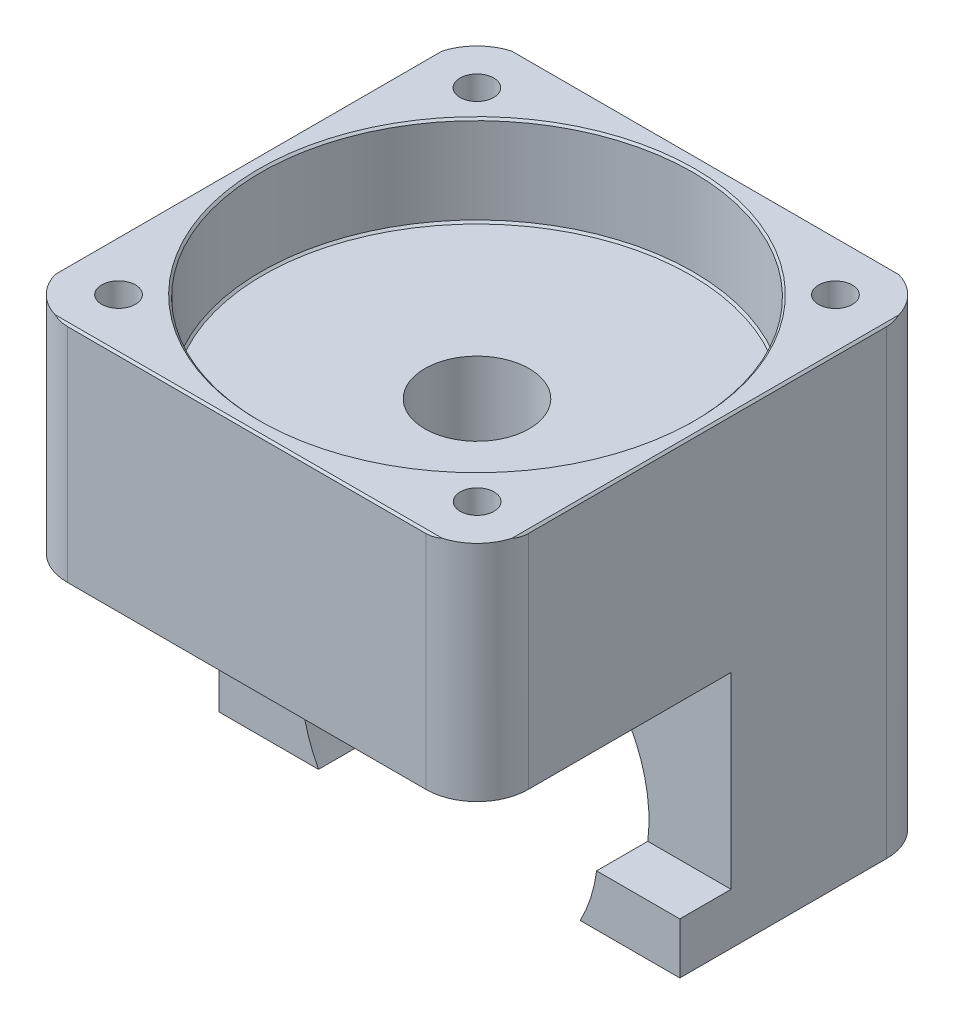
ISO-10303-21;
HEADER;
FILE_DESCRIPTION(('STEP AP214'),'2;1');
FILE_NAME('part.step','',(''),(''),'','','');
FILE_SCHEMA(('AUTOMOTIVE_DESIGN { 1 0 10303 214 1 1 1 1 }'));
ENDSEC;
DATA;
#1=APPLICATION_CONTEXT('core data for automotive mechanical design processes');
#2=APPLICATION_PROTOCOL_DEFINITION('international standard','automotive_design',2000,#1);
#3=PRODUCT_CONTEXT('',#1,'mechanical');
#4=PRODUCT('Part','Part','',(#3));
#5=PRODUCT_RELATED_PRODUCT_CATEGORY('part','',(#4));
#6=PRODUCT_DEFINITION_FORMATION('','',#4);
#7=PRODUCT_DEFINITION_CONTEXT('part definition',#1,'design');
#8=PRODUCT_DEFINITION('design','',#6,#7);
#9=PRODUCT_DEFINITION_SHAPE('','',#8);
#10=(LENGTH_UNIT() NAMED_UNIT(*) SI_UNIT(.MILLI.,.METRE.));
#11=(NAMED_UNIT(*) PLANE_ANGLE_UNIT() SI_UNIT($,.RADIAN.));
#12=(NAMED_UNIT(*) SI_UNIT($,.STERADIAN.) SOLID_ANGLE_UNIT());
#13=UNCERTAINTY_MEASURE_WITH_UNIT(LENGTH_MEASURE(1.E-05),#10,'distance_accuracy_value','');
#14=(GEOMETRIC_REPRESENTATION_CONTEXT(3) GLOBAL_UNCERTAINTY_ASSIGNED_CONTEXT((#13)) GLOBAL_UNIT_ASSIGNED_CONTEXT((#10,
#11,#12)) REPRESENTATION_CONTEXT('',''));
#15=CARTESIAN_POINT('',(0.,0.,0.));
#16=DIRECTION('',(0.,0.,1.));
#17=DIRECTION('',(1.,0.,0.));
#18=AXIS2_PLACEMENT_3D('',#15,#16,#17);
#19=CARTESIAN_POINT('',(-17.5126870222207,60.,17.5));
#20=DIRECTION('',(0.,-1.,0.));
#21=DIRECTION('',(0.,0.,-1.));
#22=AXIS2_PLACEMENT_3D('',#19,#20,#21);
#23=CYLINDRICAL_SURFACE('',#22,5.);
#24=DIRECTION('',(0.,-1.,0.));
#25=VECTOR('',#24,1.);
#26=CARTESIAN_POINT('',(-17.5126870222207,60.,22.5));
#27=LINE('',#26,#25);
#28=CARTESIAN_POINT('',(-17.5126870222207,59.8,22.5));
#29=VERTEX_POINT('',#28);
#30=CARTESIAN_POINT('',(-17.5126870222207,38.1506542929803,22.5));
#31=VERTEX_POINT('',#30);
#32=EDGE_CURVE('E342',#29,#31,#27,.T.);
#33=ORIENTED_EDGE('',*,*,#32,.F.);
#34=CARTESIAN_POINT('',(-17.5126870222207,64.8,17.5));
#35=DIRECTION('',(0.,-0.707106781186548,-0.707106781186548));
#36=DIRECTION('',(0.,-0.707106781186548,0.707106781186548));
#37=AXIS2_PLACEMENT_3D('',#34,#35,#36);
#38=ELLIPSE('',#37,7.07106781186547,5.);
#39=CARTESIAN_POINT('',(-18.9126870222207,60.,22.3));
#40=VERTEX_POINT('',#39);
#41=EDGE_CURVE('E48',#40,#29,#38,.F.);
#42=ORIENTED_EDGE('',*,*,#41,.F.);
#43=CARTESIAN_POINT('',(-17.5126870222207,60.,17.5));
#44=DIRECTION('',(0.,-1.,0.));
#45=DIRECTION('',(0.,0.,-1.));
#46=AXIS2_PLACEMENT_3D('',#43,#44,#45);
#47=CIRCLE('',#46,5.);
#48=CARTESIAN_POINT('',(-22.3126870222207,60.,18.9));
#49=VERTEX_POINT('',#48);
#50=EDGE_CURVE('E353',#49,#40,#47,.F.);
#51=ORIENTED_EDGE('',*,*,#50,.F.);
#52=CARTESIAN_POINT('',(-17.5126870222207,64.8,17.5));
#53=DIRECTION('',(0.707106781186548,-0.707106781186548,0.));
#54=DIRECTION('',(-0.707106781186548,-0.707106781186548,0.));
#55=AXIS2_PLACEMENT_3D('',#52,#53,#54);
#56=ELLIPSE('',#55,7.07106781186547,5.);
#57=CARTESIAN_POINT('',(-22.5126870222207,59.8,17.5));
#58=VERTEX_POINT('',#57);
#59=EDGE_CURVE('E354',#58,#49,#56,.F.);
#60=ORIENTED_EDGE('',*,*,#59,.F.);
#61=DIRECTION('',(0.,-1.,0.));
#62=VECTOR('',#61,1.);
#63=CARTESIAN_POINT('',(-22.5126870222207,60.,17.5));
#64=LINE('',#63,#62);
#65=CARTESIAN_POINT('',(-22.5126870222207,38.1506542929803,17.5));
#66=VERTEX_POINT('',#65);
#67=EDGE_CURVE('E350',#66,#58,#64,.F.);
#68=ORIENTED_EDGE('',*,*,#67,.F.);
#69=CARTESIAN_POINT('',(-17.5126870222207,38.1506542929803,17.5));
#70=DIRECTION('',(0.,1.,0.));
#71=DIRECTION('',(0.,0.,1.));
#72=AXIS2_PLACEMENT_3D('',#69,#70,#71);
#73=CIRCLE('',#72,5.);
#74=EDGE_CURVE('E11',#31,#66,#73,.F.);
#75=ORIENTED_EDGE('',*,*,#74,.F.);
#76=EDGE_LOOP('',(#33,#42,#51,#60,#68,#75));
#77=FACE_BOUND('',#76,.T.);
#78=ADVANCED_FACE('F41',(#77),#23,.T.);
#79=CARTESIAN_POINT('',(17.5126870222207,60.,17.5));
#80=DIRECTION('',(0.,-1.,0.));
#81=DIRECTION('',(0.,0.,-1.));
#82=AXIS2_PLACEMENT_3D('',#79,#80,#81);
#83=CYLINDRICAL_SURFACE('',#82,5.);
#84=DIRECTION('',(0.,-1.,0.));
#85=VECTOR('',#84,1.);
#86=CARTESIAN_POINT('',(22.5126870222207,60.,17.5));
#87=LINE('',#86,#85);
#88=CARTESIAN_POINT('',(22.5126870222207,59.8,17.5));
#89=VERTEX_POINT('',#88);
#90=CARTESIAN_POINT('',(22.5126870222207,38.1506542929803,17.5));
#91=VERTEX_POINT('',#90);
#92=EDGE_CURVE('E328',#89,#91,#87,.T.);
#93=ORIENTED_EDGE('',*,*,#92,.F.);
#94=CARTESIAN_POINT('',(17.5126870222207,64.8,17.5));
#95=DIRECTION('',(-0.707106781186548,-0.707106781186548,0.));
#96=DIRECTION('',(0.707106781186548,-0.707106781186548,0.));
#97=AXIS2_PLACEMENT_3D('',#94,#95,#96);
#98=ELLIPSE('',#97,7.07106781186547,5.);
#99=CARTESIAN_POINT('',(22.3126870222208,60.,18.9));
#100=VERTEX_POINT('',#99);
#101=EDGE_CURVE('E344',#100,#89,#98,.F.);
#102=ORIENTED_EDGE('',*,*,#101,.F.);
#103=CARTESIAN_POINT('',(17.5126870222207,60.,17.5));
#104=DIRECTION('',(0.,-1.,0.));
#105=DIRECTION('',(0.,0.,-1.));
#106=AXIS2_PLACEMENT_3D('',#103,#104,#105);
#107=CIRCLE('',#106,5.);
#108=CARTESIAN_POINT('',(18.9126870222207,60.,22.3));
#109=VERTEX_POINT('',#108);
#110=EDGE_CURVE('E336',#109,#100,#107,.F.);
#111=ORIENTED_EDGE('',*,*,#110,.F.);
#112=CARTESIAN_POINT('',(17.5126870222207,64.8,17.5));
#113=DIRECTION('',(0.,-0.707106781186548,-0.707106781186548));
#114=DIRECTION('',(0.,-0.707106781186548,0.707106781186548));
#115=AXIS2_PLACEMENT_3D('',#112,#113,#114);
#116=ELLIPSE('',#115,7.07106781186547,5.);
#117=CARTESIAN_POINT('',(17.5126870222207,59.8,22.5));
#118=VERTEX_POINT('',#117);
#119=EDGE_CURVE('E332',#118,#109,#116,.F.);
#120=ORIENTED_EDGE('',*,*,#119,.F.);
#121=DIRECTION('',(0.,-1.,0.));
#122=VECTOR('',#121,1.);
#123=CARTESIAN_POINT('',(17.5126870222207,60.,22.5));
#124=LINE('',#123,#122);
#125=CARTESIAN_POINT('',(17.5126870222207,38.1506542929803,22.5));
#126=VERTEX_POINT('',#125);
#127=EDGE_CURVE('E331',#126,#118,#124,.F.);
#128=ORIENTED_EDGE('',*,*,#127,.F.);
#129=CARTESIAN_POINT('',(17.5126870222207,38.1506542929803,17.5));
#130=DIRECTION('',(0.,1.,0.));
#131=DIRECTION('',(0.,0.,1.));
#132=AXIS2_PLACEMENT_3D('',#129,#130,#131);
#133=CIRCLE('',#132,5.);
#134=EDGE_CURVE('E345',#91,#126,#133,.F.);
#135=ORIENTED_EDGE('',*,*,#134,.F.);
#136=EDGE_LOOP('',(#93,#102,#111,#120,#128,#135));
#137=FACE_BOUND('',#136,.T.);
#138=ADVANCED_FACE('F367',(#137),#83,.T.);
#139=CARTESIAN_POINT('',(-17.5126870222207,60.,-17.5));
#140=DIRECTION('',(0.,1.,0.));
#141=DIRECTION('',(0.,0.,1.));
#142=AXIS2_PLACEMENT_3D('',#139,#140,#141);
#143=CYLINDRICAL_SURFACE('',#142,5.);
#144=DIRECTION('',(0.,1.,0.));
#145=VECTOR('',#144,1.);
#146=CARTESIAN_POINT('',(-17.5126870222207,60.,-22.5));
#147=LINE('',#146,#145);
#148=CARTESIAN_POINT('',(-17.5126870222207,14.8,-22.5));
#149=VERTEX_POINT('',#148);
#150=CARTESIAN_POINT('',(-17.5126870222207,59.8,-22.5));
#151=VERTEX_POINT('',#150);
#152=EDGE_CURVE('E315',#149,#151,#147,.T.);
#153=ORIENTED_EDGE('',*,*,#152,.F.);
#154=CARTESIAN_POINT('',(-17.5126870222207,14.8,-17.5));
#155=DIRECTION('',(0.,1.,0.));
#156=DIRECTION('',(0.,0.,1.));
#157=AXIS2_PLACEMENT_3D('',#154,#155,#156);
#158=CIRCLE('',#157,5.);
#159=CARTESIAN_POINT('',(-22.5126870222207,14.8,-17.5));
#160=VERTEX_POINT('',#159);
#161=EDGE_CURVE('E326',#160,#149,#158,.F.);
#162=ORIENTED_EDGE('',*,*,#161,.F.);
#163=DIRECTION('',(0.,1.,0.));
#164=VECTOR('',#163,1.);
#165=CARTESIAN_POINT('',(-22.5126870222207,60.,-17.5));
#166=LINE('',#165,#164);
#167=CARTESIAN_POINT('',(-22.5126870222207,59.8,-17.5));
#168=VERTEX_POINT('',#167);
#169=EDGE_CURVE('E323',#168,#160,#166,.F.);
#170=ORIENTED_EDGE('',*,*,#169,.F.);
#171=CARTESIAN_POINT('',(-17.5126870222207,64.8,-17.5));
#172=DIRECTION('',(0.707106781186548,-0.707106781186548,0.));
#173=DIRECTION('',(0.707106781186548,0.707106781186548,0.));
#174=AXIS2_PLACEMENT_3D('',#171,#172,#173);
#175=ELLIPSE('',#174,7.07106781186547,5.);
#176=CARTESIAN_POINT('',(-22.3126870222207,60.,-18.9));
#177=VERTEX_POINT('',#176);
#178=EDGE_CURVE('E324',#177,#168,#175,.F.);
#179=ORIENTED_EDGE('',*,*,#178,.F.);
#180=CARTESIAN_POINT('',(-17.5126870222207,60.,-17.5));
#181=DIRECTION('',(0.,-1.,0.));
#182=DIRECTION('',(0.,0.,-1.));
#183=AXIS2_PLACEMENT_3D('',#180,#181,#182);
#184=CIRCLE('',#183,5.);
#185=CARTESIAN_POINT('',(-18.9126870222207,60.,-22.3));
#186=VERTEX_POINT('',#185);
#187=EDGE_CURVE('E319',#186,#177,#184,.F.);
#188=ORIENTED_EDGE('',*,*,#187,.F.);
#189=CARTESIAN_POINT('',(-17.5126870222207,64.8,-17.5));
#190=DIRECTION('',(0.,-0.707106781186548,0.707106781186548));
#191=DIRECTION('',(0.,0.707106781186548,0.707106781186548));
#192=AXIS2_PLACEMENT_3D('',#189,#190,#191);
#193=ELLIPSE('',#192,7.07106781186547,5.);
#194=EDGE_CURVE('E314',#151,#186,#193,.F.);
#195=ORIENTED_EDGE('',*,*,#194,.F.);
#196=EDGE_LOOP('',(#153,#162,#170,#179,#188,#195));
#197=FACE_BOUND('',#196,.T.);
#198=ADVANCED_FACE('F421',(#197),#143,.T.);
#199=CARTESIAN_POINT('',(17.5126870222207,60.,-17.5));
#200=DIRECTION('',(0.,-1.,0.));
#201=DIRECTION('',(0.,0.,-1.));
#202=AXIS2_PLACEMENT_3D('',#199,#200,#201);
#203=CYLINDRICAL_SURFACE('',#202,5.);
#204=DIRECTION('',(0.,-1.,0.));
#205=VECTOR('',#204,1.);
#206=CARTESIAN_POINT('',(17.5126870222207,60.,-22.5));
#207=LINE('',#206,#205);
#208=CARTESIAN_POINT('',(17.5126870222207,59.8,-22.5));
#209=VERTEX_POINT('',#208);
#210=CARTESIAN_POINT('',(17.5126870222207,14.8,-22.5));
#211=VERTEX_POINT('',#210);
#212=EDGE_CURVE('E294',#209,#211,#207,.T.);
#213=ORIENTED_EDGE('',*,*,#212,.F.);
#214=CARTESIAN_POINT('',(17.5126870222207,64.8,-17.5));
#215=DIRECTION('',(0.,-0.707106781186548,0.707106781186548));
#216=DIRECTION('',(0.,-0.707106781186548,-0.707106781186548));
#217=AXIS2_PLACEMENT_3D('',#214,#215,#216);
#218=ELLIPSE('',#217,7.07106781186547,5.);
#219=CARTESIAN_POINT('',(18.9126870222207,60.,-22.3));
#220=VERTEX_POINT('',#219);
#221=EDGE_CURVE('E310',#220,#209,#218,.F.);
#222=ORIENTED_EDGE('',*,*,#221,.F.);
#223=CARTESIAN_POINT('',(17.5126870222207,60.,-17.5));
#224=DIRECTION('',(0.,-1.,0.));
#225=DIRECTION('',(0.,0.,-1.));
#226=AXIS2_PLACEMENT_3D('',#223,#224,#225);
#227=CIRCLE('',#226,5.);
#228=CARTESIAN_POINT('',(22.3126870222207,60.,-18.9));
#229=VERTEX_POINT('',#228);
#230=EDGE_CURVE('E302',#229,#220,#227,.F.);
#231=ORIENTED_EDGE('',*,*,#230,.F.);
#232=CARTESIAN_POINT('',(17.5126870222207,64.8,-17.5));
#233=DIRECTION('',(-0.707106781186548,-0.707106781186548,0.));
#234=DIRECTION('',(0.707106781186548,-0.707106781186548,0.));
#235=AXIS2_PLACEMENT_3D('',#232,#233,#234);
#236=ELLIPSE('',#235,7.07106781186547,5.);
#237=CARTESIAN_POINT('',(22.5126870222207,59.8,-17.5));
#238=VERTEX_POINT('',#237);
#239=EDGE_CURVE('E301',#238,#229,#236,.F.);
#240=ORIENTED_EDGE('',*,*,#239,.F.);
#241=DIRECTION('',(0.,-1.,0.));
#242=VECTOR('',#241,1.);
#243=CARTESIAN_POINT('',(22.5126870222207,60.,-17.5));
#244=LINE('',#243,#242);
#245=CARTESIAN_POINT('',(22.5126870222207,14.8,-17.5));
#246=VERTEX_POINT('',#245);
#247=EDGE_CURVE('E296',#246,#238,#244,.F.);
#248=ORIENTED_EDGE('',*,*,#247,.F.);
#249=CARTESIAN_POINT('',(17.5126870222207,14.8,-17.5));
#250=DIRECTION('',(0.,1.,0.));
#251=DIRECTION('',(0.,0.,1.));
#252=AXIS2_PLACEMENT_3D('',#249,#250,#251);
#253=CIRCLE('',#252,5.);
#254=EDGE_CURVE('E309',#211,#246,#253,.F.);
#255=ORIENTED_EDGE('',*,*,#254,.F.);
#256=EDGE_LOOP('',(#213,#222,#231,#240,#248,#255));
#257=FACE_BOUND('',#256,.T.);
#258=ADVANCED_FACE('F385',(#257),#203,.T.);
#259=CARTESIAN_POINT('',(22.5126870222207,60.,22.5));
#260=DIRECTION('',(-1.,0.,0.));
#261=DIRECTION('',(0.,0.,1.));
#262=AXIS2_PLACEMENT_3D('',#259,#260,#261);
#263=PLANE('',#262);
#264=DIRECTION('',(0.,0.,1.));
#265=VECTOR('',#264,1.);
#266=CARTESIAN_POINT('',(22.5126870222207,59.8,22.5));
#267=LINE('',#266,#265);
#268=EDGE_CURVE('E276',#238,#89,#267,.T.);
#269=ORIENTED_EDGE('',*,*,#268,.T.);
#270=ORIENTED_EDGE('',*,*,#92,.T.);
#271=DIRECTION('',(0.,0.,1.));
#272=VECTOR('',#271,1.);
#273=CARTESIAN_POINT('',(22.5126870222207,38.1506542929803,-2.3));
#274=LINE('',#273,#272);
#275=CARTESIAN_POINT('',(22.5126870222207,38.1506542929803,-2.3));
#276=VERTEX_POINT('',#275);
#277=EDGE_CURVE('E235',#276,#91,#274,.T.);
#278=ORIENTED_EDGE('',*,*,#277,.F.);
#279=DIRECTION('',(0.,1.,0.));
#280=VECTOR('',#279,1.);
#281=CARTESIAN_POINT('',(22.5126870222207,38.1506542929803,-2.3));
#282=LINE('',#281,#280);
#283=CARTESIAN_POINT('',(22.5126870222207,19.8,-2.3));
#284=VERTEX_POINT('',#283);
#285=EDGE_CURVE('E184',#284,#276,#282,.T.);
#286=ORIENTED_EDGE('',*,*,#285,.F.);
#287=DIRECTION('',(0.,0.,-1.));
#288=VECTOR('',#287,1.);
#289=CARTESIAN_POINT('',(22.5126870222207,19.8,2.7));
#290=LINE('',#289,#288);
#291=CARTESIAN_POINT('',(22.5126870222207,19.8,2.7));
#292=VERTEX_POINT('',#291);
#293=EDGE_CURVE('E54',#292,#284,#290,.T.);
#294=ORIENTED_EDGE('',*,*,#293,.F.);
#295=DIRECTION('',(0.,-1.,0.));
#296=VECTOR('',#295,1.);
#297=CARTESIAN_POINT('',(22.5126870222207,14.8,2.7));
#298=LINE('',#297,#296);
#299=CARTESIAN_POINT('',(22.5126870222207,14.8,2.7));
#300=VERTEX_POINT('',#299);
#301=EDGE_CURVE('E185',#292,#300,#298,.T.);
#302=ORIENTED_EDGE('',*,*,#301,.T.);
#303=DIRECTION('',(0.,0.,1.));
#304=VECTOR('',#303,1.);
#305=CARTESIAN_POINT('',(22.5126870222207,14.8,-22.5));
#306=LINE('',#305,#304);
#307=EDGE_CURVE('E238',#246,#300,#306,.T.);
#308=ORIENTED_EDGE('',*,*,#307,.F.);
#309=ORIENTED_EDGE('',*,*,#247,.T.);
#310=EDGE_LOOP('',(#269,#270,#278,#286,#294,#302,#308,#309));
#311=FACE_BOUND('',#310,.T.);
#312=ADVANCED_FACE('F179',(#311),#263,.F.);
#313=CARTESIAN_POINT('',(0.,14.8,0.));
#314=DIRECTION('',(0.,1.,0.));
#315=DIRECTION('',(0.,0.,1.));
#316=AXIS2_PLACEMENT_3D('',#313,#314,#315);
#317=PLANE('',#316);
#318=DIRECTION('',(1.,0.,0.));
#319=VECTOR('',#318,1.);
#320=CARTESIAN_POINT('',(-22.5126870222207,14.8,-22.5));
#321=LINE('',#320,#319);
#322=CARTESIAN_POINT('',(12.7796140692147,14.8,-22.5));
#323=VERTEX_POINT('',#322);
#324=EDGE_CURVE('E244',#323,#211,#321,.T.);
#325=ORIENTED_EDGE('',*,*,#324,.T.);
#326=ORIENTED_EDGE('',*,*,#254,.T.);
#327=ORIENTED_EDGE('',*,*,#307,.T.);
#328=DIRECTION('',(-1.,0.,0.));
#329=VECTOR('',#328,1.);
#330=CARTESIAN_POINT('',(22.5126870222207,14.8,2.7));
#331=LINE('',#330,#329);
#332=CARTESIAN_POINT('',(12.7796140692147,14.8,2.7));
#333=VERTEX_POINT('',#332);
#334=EDGE_CURVE('E192',#300,#333,#331,.T.);
#335=ORIENTED_EDGE('',*,*,#334,.T.);
#336=DIRECTION('',(0.,0.,1.));
#337=VECTOR('',#336,1.);
#338=CARTESIAN_POINT('',(12.7796140692147,14.8,-22.5));
#339=LINE('',#338,#337);
#340=EDGE_CURVE('E290',#323,#333,#339,.T.);
#341=ORIENTED_EDGE('',*,*,#340,.F.);
#342=EDGE_LOOP('',(#325,#326,#327,#335,#341));
#343=FACE_BOUND('',#342,.T.);
#344=ADVANCED_FACE('F383',(#343),#317,.F.);
#345=DIRECTION('',(0.,0.,-1.));
#346=VECTOR('',#345,1.);
#347=CARTESIAN_POINT('',(-22.5126870222207,14.8,-22.5));
#348=LINE('',#347,#346);
#349=CARTESIAN_POINT('',(-22.5126870222207,14.8,2.7));
#350=VERTEX_POINT('',#349);
#351=EDGE_CURVE('E245',#350,#160,#348,.T.);
#352=ORIENTED_EDGE('',*,*,#351,.T.);
#353=ORIENTED_EDGE('',*,*,#161,.T.);
#354=CARTESIAN_POINT('',(-12.7796140692147,14.8,-22.5));
#355=VERTEX_POINT('',#354);
#356=EDGE_CURVE('E246',#149,#355,#321,.T.);
#357=ORIENTED_EDGE('',*,*,#356,.T.);
#358=DIRECTION('',(0.,0.,1.));
#359=VECTOR('',#358,1.);
#360=CARTESIAN_POINT('',(-12.7796140692147,14.8,-22.5));
#361=LINE('',#360,#359);
#362=CARTESIAN_POINT('',(-12.7796140692147,14.8,2.7));
#363=VERTEX_POINT('',#362);
#364=EDGE_CURVE('E287',#363,#355,#361,.F.);
#365=ORIENTED_EDGE('',*,*,#364,.F.);
#366=DIRECTION('',(1.,0.,0.));
#367=VECTOR('',#366,1.);
#368=CARTESIAN_POINT('',(-22.5126870222207,14.8,2.7));
#369=LINE('',#368,#367);
#370=EDGE_CURVE('E214',#350,#363,#369,.T.);
#371=ORIENTED_EDGE('',*,*,#370,.F.);
#372=EDGE_LOOP('',(#352,#353,#357,#365,#371));
#373=FACE_BOUND('',#372,.T.);
#374=ADVANCED_FACE('F422',(#373),#317,.F.);
#375=CARTESIAN_POINT('',(-22.5126870222207,60.,22.5));
#376=DIRECTION('',(0.,0.,-1.));
#377=DIRECTION('',(-1.,0.,0.));
#378=AXIS2_PLACEMENT_3D('',#375,#376,#377);
#379=PLANE('',#378);
#380=DIRECTION('',(-1.,0.,0.));
#381=VECTOR('',#380,1.);
#382=CARTESIAN_POINT('',(-22.5126870222207,59.8,22.5));
#383=LINE('',#382,#381);
#384=EDGE_CURVE('E267',#118,#29,#383,.T.);
#385=ORIENTED_EDGE('',*,*,#384,.T.);
#386=ORIENTED_EDGE('',*,*,#32,.T.);
#387=DIRECTION('',(-1.,0.,0.));
#388=VECTOR('',#387,1.);
#389=CARTESIAN_POINT('',(-22.5126870222207,38.1506542929803,22.5));
#390=LINE('',#389,#388);
#391=EDGE_CURVE('E222',#126,#31,#390,.T.);
#392=ORIENTED_EDGE('',*,*,#391,.F.);
#393=ORIENTED_EDGE('',*,*,#127,.T.);
#394=EDGE_LOOP('',(#385,#386,#392,#393));
#395=FACE_BOUND('',#394,.T.);
#396=ADVANCED_FACE('F362',(#395),#379,.F.);
#397=CARTESIAN_POINT('',(0.,21.6506542929803,-22.5));
#398=DIRECTION('',(0.,0.,1.));
#399=DIRECTION('',(1.,0.,0.));
#400=AXIS2_PLACEMENT_3D('',#397,#398,#399);
#401=CYLINDRICAL_SURFACE('',#400,14.5);
#402=CARTESIAN_POINT('',(0.,21.6506542929803,-2.3));
#403=DIRECTION('',(0.,0.,1.));
#404=DIRECTION('',(1.,0.,0.));
#405=AXIS2_PLACEMENT_3D('',#402,#403,#404);
#406=CIRCLE('',#405,14.5);
#407=CARTESIAN_POINT('',(-14.3814143493564,19.8,-2.3));
#408=VERTEX_POINT('',#407);
#409=CARTESIAN_POINT('',(14.3814143493564,19.8,-2.3));
#410=VERTEX_POINT('',#409);
#411=EDGE_CURVE('E291',#408,#410,#406,.F.);
#412=ORIENTED_EDGE('',*,*,#411,.F.);
#413=DIRECTION('',(0.,0.,-1.));
#414=VECTOR('',#413,1.);
#415=CARTESIAN_POINT('',(-14.3814143493564,19.8,2.7));
#416=LINE('',#415,#414);
#417=CARTESIAN_POINT('',(-14.3814143493564,19.8,2.7));
#418=VERTEX_POINT('',#417);
#419=EDGE_CURVE('E221',#418,#408,#416,.T.);
#420=ORIENTED_EDGE('',*,*,#419,.F.);
#421=CARTESIAN_POINT('',(0.,21.6506542929803,2.7));
#422=DIRECTION('',(0.,0.,-1.));
#423=DIRECTION('',(-1.,0.,0.));
#424=AXIS2_PLACEMENT_3D('',#421,#422,#423);
#425=CIRCLE('',#424,14.5);
#426=EDGE_CURVE('E213',#363,#418,#425,.T.);
#427=ORIENTED_EDGE('',*,*,#426,.F.);
#428=ORIENTED_EDGE('',*,*,#364,.T.);
#429=CARTESIAN_POINT('',(0.,21.6506542929803,-22.5));
#430=DIRECTION('',(0.,0.,1.));
#431=DIRECTION('',(1.,0.,0.));
#432=AXIS2_PLACEMENT_3D('',#429,#430,#431);
#433=CIRCLE('',#432,14.5);
#434=EDGE_CURVE('E247',#323,#355,#433,.T.);
#435=ORIENTED_EDGE('',*,*,#434,.F.);
#436=ORIENTED_EDGE('',*,*,#340,.T.);
#437=CARTESIAN_POINT('',(0.,21.6506542929803,2.7));
#438=DIRECTION('',(0.,0.,1.));
#439=DIRECTION('',(1.,0.,0.));
#440=AXIS2_PLACEMENT_3D('',#437,#438,#439);
#441=CIRCLE('',#440,14.5);
#442=CARTESIAN_POINT('',(14.3814143493564,19.8,2.7));
#443=VERTEX_POINT('',#442);
#444=EDGE_CURVE('E198',#333,#443,#441,.T.);
#445=ORIENTED_EDGE('',*,*,#444,.T.);
#446=DIRECTION('',(0.,0.,-1.));
#447=VECTOR('',#446,1.);
#448=CARTESIAN_POINT('',(14.3814143493564,19.8,2.7));
#449=LINE('',#448,#447);
#450=EDGE_CURVE('E187',#443,#410,#449,.T.);
#451=ORIENTED_EDGE('',*,*,#450,.T.);
#452=EDGE_LOOP('',(#412,#420,#427,#428,#435,#436,#445,#451));
#453=FACE_BOUND('',#452,.T.);
#454=ADVANCED_FACE('F414',(#453),#401,.F.);
#455=CARTESIAN_POINT('',(-22.5126870222207,60.,22.5));
#456=DIRECTION('',(1.,0.,0.));
#457=DIRECTION('',(0.,0.,-1.));
#458=AXIS2_PLACEMENT_3D('',#455,#456,#457);
#459=PLANE('',#458);
#460=DIRECTION('',(0.,0.,1.));
#461=VECTOR('',#460,1.);
#462=CARTESIAN_POINT('',(-22.5126870222207,38.1506542929803,-2.3));
#463=LINE('',#462,#461);
#464=CARTESIAN_POINT('',(-22.5126870222207,38.1506542929803,-2.3));
#465=VERTEX_POINT('',#464);
#466=EDGE_CURVE('E232',#465,#66,#463,.T.);
#467=ORIENTED_EDGE('',*,*,#466,.T.);
#468=ORIENTED_EDGE('',*,*,#67,.T.);
#469=DIRECTION('',(0.,0.,-1.));
#470=VECTOR('',#469,1.);
#471=CARTESIAN_POINT('',(-22.5126870222207,59.8,22.5));
#472=LINE('',#471,#470);
#473=EDGE_CURVE('E271',#58,#168,#472,.T.);
#474=ORIENTED_EDGE('',*,*,#473,.T.);
#475=ORIENTED_EDGE('',*,*,#169,.T.);
#476=ORIENTED_EDGE('',*,*,#351,.F.);
#477=DIRECTION('',(0.,-1.,0.));
#478=VECTOR('',#477,1.);
#479=CARTESIAN_POINT('',(-22.5126870222207,14.8,2.7));
#480=LINE('',#479,#478);
#481=CARTESIAN_POINT('',(-22.5126870222207,19.8,2.7));
#482=VERTEX_POINT('',#481);
#483=EDGE_CURVE('E206',#482,#350,#480,.T.);
#484=ORIENTED_EDGE('',*,*,#483,.F.);
#485=DIRECTION('',(0.,0.,-1.));
#486=VECTOR('',#485,1.);
#487=CARTESIAN_POINT('',(-22.5126870222207,19.8,2.7));
#488=LINE('',#487,#486);
#489=CARTESIAN_POINT('',(-22.5126870222207,19.8,-2.3));
#490=VERTEX_POINT('',#489);
#491=EDGE_CURVE('E220',#482,#490,#488,.T.);
#492=ORIENTED_EDGE('',*,*,#491,.T.);
#493=DIRECTION('',(0.,-1.,0.));
#494=VECTOR('',#493,1.);
#495=CARTESIAN_POINT('',(-22.5126870222207,38.1506542929803,-2.3));
#496=LINE('',#495,#494);
#497=EDGE_CURVE('E228',#465,#490,#496,.T.);
#498=ORIENTED_EDGE('',*,*,#497,.F.);
#499=EDGE_LOOP('',(#467,#468,#474,#475,#476,#484,#492,#498));
#500=FACE_BOUND('',#499,.T.);
#501=ADVANCED_FACE('F405',(#500),#459,.F.);
#502=CARTESIAN_POINT('',(-22.5126870222207,60.,-22.5));
#503=DIRECTION('',(0.,0.,1.));
#504=DIRECTION('',(1.,0.,0.));
#505=AXIS2_PLACEMENT_3D('',#502,#503,#504);
#506=PLANE('',#505);
#507=ORIENTED_EDGE('',*,*,#356,.F.);
#508=ORIENTED_EDGE('',*,*,#152,.T.);
#509=DIRECTION('',(1.,0.,0.));
#510=VECTOR('',#509,1.);
#511=CARTESIAN_POINT('',(-22.5126870222207,59.8,-22.5));
#512=LINE('',#511,#510);
#513=EDGE_CURVE('E273',#151,#209,#512,.T.);
#514=ORIENTED_EDGE('',*,*,#513,.T.);
#515=ORIENTED_EDGE('',*,*,#212,.T.);
#516=ORIENTED_EDGE('',*,*,#324,.F.);
#517=ORIENTED_EDGE('',*,*,#434,.T.);
#518=EDGE_LOOP('',(#507,#508,#514,#515,#516,#517));
#519=FACE_BOUND('',#518,.T.);
#520=ADVANCED_FACE('F388',(#519),#506,.F.);
#521=CARTESIAN_POINT('',(0.,60.,0.));
#522=DIRECTION('',(0.,-1.,0.));
#523=DIRECTION('',(0.,0.,-1.));
#524=AXIS2_PLACEMENT_3D('',#521,#522,#523);
#525=PLANE('',#524);
#526=CARTESIAN_POINT('',(17.5126870222207,60.,17.5));
#527=DIRECTION('',(0.,1.,0.));
#528=DIRECTION('',(0.,0.,-1.));
#529=AXIS2_PLACEMENT_3D('',#526,#527,#528);
#530=CIRCLE('',#529,1.65);
#531=CARTESIAN_POINT('',(17.5126870222207,60.,15.85));
#532=VERTEX_POINT('',#531);
#533=EDGE_CURVE('E788',#532,#532,#530,.T.);
#534=ORIENTED_EDGE('',*,*,#533,.F.);
#535=EDGE_LOOP('',(#534));
#536=FACE_BOUND('',#535,.T.);
#537=CARTESIAN_POINT('',(17.5126870222207,60.,-17.5));
#538=DIRECTION('',(0.,-1.,0.));
#539=DIRECTION('',(0.,0.,1.));
#540=AXIS2_PLACEMENT_3D('',#537,#538,#539);
#541=CIRCLE('',#540,1.65);
#542=CARTESIAN_POINT('',(17.5126870222207,60.,-15.85));
#543=VERTEX_POINT('',#542);
#544=EDGE_CURVE('E790',#543,#543,#541,.T.);
#545=ORIENTED_EDGE('',*,*,#544,.T.);
#546=EDGE_LOOP('',(#545));
#547=FACE_BOUND('',#546,.T.);
#548=CARTESIAN_POINT('',(-17.5126870222207,60.,17.5));
#549=DIRECTION('',(0.,-1.,0.));
#550=DIRECTION('',(0.,0.,-1.));
#551=AXIS2_PLACEMENT_3D('',#548,#549,#550);
#552=CIRCLE('',#551,1.65);
#553=CARTESIAN_POINT('',(-17.5126870222207,60.,15.85));
#554=VERTEX_POINT('',#553);
#555=EDGE_CURVE('E800',#554,#554,#552,.T.);
#556=ORIENTED_EDGE('',*,*,#555,.T.);
#557=EDGE_LOOP('',(#556));
#558=FACE_BOUND('',#557,.T.);
#559=CARTESIAN_POINT('',(-17.5126870222207,60.,-17.5));
#560=DIRECTION('',(0.,1.,0.));
#561=DIRECTION('',(0.,0.,1.));
#562=AXIS2_PLACEMENT_3D('',#559,#560,#561);
#563=CIRCLE('',#562,1.65);
#564=CARTESIAN_POINT('',(-17.5126870222207,60.,-15.85));
#565=VERTEX_POINT('',#564);
#566=EDGE_CURVE('E805',#565,#565,#563,.T.);
#567=ORIENTED_EDGE('',*,*,#566,.F.);
#568=EDGE_LOOP('',(#567));
#569=FACE_BOUND('',#568,.T.);
#570=DIRECTION('',(0.,0.,1.));
#571=VECTOR('',#570,1.);
#572=CARTESIAN_POINT('',(-22.3126870222207,60.,0.));
#573=LINE('',#572,#571);
#574=EDGE_CURVE('E262',#177,#49,#573,.T.);
#575=ORIENTED_EDGE('',*,*,#574,.T.);
#576=ORIENTED_EDGE('',*,*,#50,.T.);
#577=DIRECTION('',(1.,0.,0.));
#578=VECTOR('',#577,1.);
#579=CARTESIAN_POINT('',(0.,60.,22.3));
#580=LINE('',#579,#578);
#581=EDGE_CURVE('E270',#40,#109,#580,.T.);
#582=ORIENTED_EDGE('',*,*,#581,.T.);
#583=ORIENTED_EDGE('',*,*,#110,.T.);
#584=DIRECTION('',(0.,0.,-1.));
#585=VECTOR('',#584,1.);
#586=CARTESIAN_POINT('',(22.3126870222207,60.,0.));
#587=LINE('',#586,#585);
#588=EDGE_CURVE('E257',#100,#229,#587,.T.);
#589=ORIENTED_EDGE('',*,*,#588,.T.);
#590=ORIENTED_EDGE('',*,*,#230,.T.);
#591=DIRECTION('',(-1.,0.,0.));
#592=VECTOR('',#591,1.);
#593=CARTESIAN_POINT('',(0.,60.,-22.3));
#594=LINE('',#593,#592);
#595=EDGE_CURVE('E261',#220,#186,#594,.T.);
#596=ORIENTED_EDGE('',*,*,#595,.T.);
#597=ORIENTED_EDGE('',*,*,#187,.T.);
#598=EDGE_LOOP('',(#575,#576,#582,#583,#589,#590,#596,#597));
#599=FACE_BOUND('',#598,.T.);
#600=CARTESIAN_POINT('',(0.,60.,0.));
#601=DIRECTION('',(0.,-1.,0.));
#602=DIRECTION('',(0.,0.,-1.));
#603=AXIS2_PLACEMENT_3D('',#600,#601,#602);
#604=CIRCLE('',#603,21.3);
#605=CARTESIAN_POINT('',(0.,60.,-21.3));
#606=VERTEX_POINT('',#605);
#607=EDGE_CURVE('E253',#606,#606,#604,.T.);
#608=ORIENTED_EDGE('',*,*,#607,.T.);
#609=EDGE_LOOP('',(#608));
#610=FACE_BOUND('',#609,.T.);
#611=ADVANCED_FACE('F373',(#536,#547,#558,#569,#599,#610),#525,.F.);
#612=CARTESIAN_POINT('',(0.,51.2,0.));
#613=DIRECTION('',(0.,1.,0.));
#614=DIRECTION('',(0.,0.,1.));
#615=AXIS2_PLACEMENT_3D('',#612,#613,#614);
#616=CYLINDRICAL_SURFACE('',#615,21.1);
#617=CARTESIAN_POINT('',(0.,59.8,0.));
#618=DIRECTION('',(0.,-1.,0.));
#619=DIRECTION('',(0.,0.,-1.));
#620=AXIS2_PLACEMENT_3D('',#617,#618,#619);
#621=CIRCLE('',#620,21.1);
#622=CARTESIAN_POINT('',(0.,59.8,-21.1));
#623=VERTEX_POINT('',#622);
#624=EDGE_CURVE('E281',#623,#623,#621,.F.);
#625=ORIENTED_EDGE('',*,*,#624,.T.);
#626=EDGE_LOOP('',(#625));
#627=FACE_BOUND('',#626,.T.);
#628=CARTESIAN_POINT('',(0.,51.4,0.));
#629=DIRECTION('',(0.,1.,0.));
#630=DIRECTION('',(0.,0.,1.));
#631=AXIS2_PLACEMENT_3D('',#628,#629,#630);
#632=CIRCLE('',#631,21.1);
#633=CARTESIAN_POINT('',(0.,51.4,21.1));
#634=VERTEX_POINT('',#633);
#635=EDGE_CURVE('E278',#634,#634,#632,.F.);
#636=ORIENTED_EDGE('',*,*,#635,.T.);
#637=EDGE_LOOP('',(#636));
#638=FACE_BOUND('',#637,.T.);
#639=ADVANCED_FACE('F569',(#627,#638),#616,.F.);
#640=CARTESIAN_POINT('',(0.,51.2,0.));
#641=DIRECTION('',(0.,1.,0.));
#642=DIRECTION('',(0.,0.,1.));
#643=AXIS2_PLACEMENT_3D('',#640,#641,#642);
#644=PLANE('',#643);
#645=CARTESIAN_POINT('',(0.,51.2,0.));
#646=DIRECTION('',(0.,1.,0.));
#647=DIRECTION('',(0.,0.,1.));
#648=AXIS2_PLACEMENT_3D('',#645,#646,#647);
#649=CIRCLE('',#648,20.9);
#650=CARTESIAN_POINT('',(0.,51.2,20.9));
#651=VERTEX_POINT('',#650);
#652=EDGE_CURVE('E282',#651,#651,#649,.T.);
#653=ORIENTED_EDGE('',*,*,#652,.T.);
#654=EDGE_LOOP('',(#653));
#655=FACE_BOUND('',#654,.T.);
#656=CARTESIAN_POINT('',(0.,51.2,0.));
#657=DIRECTION('',(0.,1.,0.));
#658=DIRECTION('',(0.,0.,1.));
#659=AXIS2_PLACEMENT_3D('',#656,#657,#658);
#660=CIRCLE('',#659,5.1);
#661=CARTESIAN_POINT('',(0.,51.2,5.1));
#662=VERTEX_POINT('',#661);
#663=EDGE_CURVE('E252',#662,#662,#660,.T.);
#664=ORIENTED_EDGE('',*,*,#663,.F.);
#665=EDGE_LOOP('',(#664));
#666=FACE_BOUND('',#665,.T.);
#667=ADVANCED_FACE('F730',(#655,#666),#644,.T.);
#668=CARTESIAN_POINT('',(0.,39.4,0.));
#669=DIRECTION('',(0.,1.,0.));
#670=DIRECTION('',(0.,0.,1.));
#671=AXIS2_PLACEMENT_3D('',#668,#669,#670);
#672=CYLINDRICAL_SURFACE('',#671,5.1);
#673=CARTESIAN_POINT('',(0.,39.4,0.));
#674=DIRECTION('',(0.,1.,0.));
#675=DIRECTION('',(0.,0.,1.));
#676=AXIS2_PLACEMENT_3D('',#673,#674,#675);
#677=CIRCLE('',#676,5.1);
#678=CARTESIAN_POINT('',(0.,39.4,5.1));
#679=VERTEX_POINT('',#678);
#680=EDGE_CURVE('E255',#679,#679,#677,.T.);
#681=ORIENTED_EDGE('',*,*,#680,.F.);
#682=EDGE_LOOP('',(#681));
#683=FACE_BOUND('',#682,.T.);
#684=ORIENTED_EDGE('',*,*,#663,.T.);
#685=EDGE_LOOP('',(#684));
#686=FACE_BOUND('',#685,.T.);
#687=ADVANCED_FACE('F720',(#683,#686),#672,.F.);
#688=CARTESIAN_POINT('',(0.,39.4,0.));
#689=DIRECTION('',(0.,1.,0.));
#690=DIRECTION('',(0.,0.,1.));
#691=AXIS2_PLACEMENT_3D('',#688,#689,#690);
#692=PLANE('',#691);
#693=ORIENTED_EDGE('',*,*,#680,.T.);
#694=EDGE_LOOP('',(#693));
#695=FACE_BOUND('',#694,.T.);
#696=ADVANCED_FACE('F708',(#695),#692,.T.);
#697=CARTESIAN_POINT('',(0.,60.,-22.3));
#698=DIRECTION('',(0.,-0.707106781186548,0.707106781186548));
#699=DIRECTION('',(-1.,0.,0.));
#700=AXIS2_PLACEMENT_3D('',#697,#698,#699);
#701=PLANE('',#700);
#702=ORIENTED_EDGE('',*,*,#513,.F.);
#703=ORIENTED_EDGE('',*,*,#194,.T.);
#704=ORIENTED_EDGE('',*,*,#595,.F.);
#705=ORIENTED_EDGE('',*,*,#221,.T.);
#706=EDGE_LOOP('',(#702,#703,#704,#705));
#707=FACE_BOUND('',#706,.T.);
#708=ADVANCED_FACE('F392',(#707),#701,.F.);
#709=CARTESIAN_POINT('',(-22.3126870222207,60.,0.));
#710=DIRECTION('',(0.707106781186548,-0.707106781186548,0.));
#711=DIRECTION('',(0.,0.,1.));
#712=AXIS2_PLACEMENT_3D('',#709,#710,#711);
#713=PLANE('',#712);
#714=ORIENTED_EDGE('',*,*,#473,.F.);
#715=ORIENTED_EDGE('',*,*,#59,.T.);
#716=ORIENTED_EDGE('',*,*,#574,.F.);
#717=ORIENTED_EDGE('',*,*,#178,.T.);
#718=EDGE_LOOP('',(#714,#715,#716,#717));
#719=FACE_BOUND('',#718,.T.);
#720=ADVANCED_FACE('F397',(#719),#713,.F.);
#721=CARTESIAN_POINT('',(22.3126870222207,60.,0.));
#722=DIRECTION('',(-0.707106781186548,-0.707106781186548,0.));
#723=DIRECTION('',(0.,0.,-1.));
#724=AXIS2_PLACEMENT_3D('',#721,#722,#723);
#725=PLANE('',#724);
#726=ORIENTED_EDGE('',*,*,#588,.F.);
#727=ORIENTED_EDGE('',*,*,#101,.T.);
#728=ORIENTED_EDGE('',*,*,#268,.F.);
#729=ORIENTED_EDGE('',*,*,#239,.T.);
#730=EDGE_LOOP('',(#726,#727,#728,#729));
#731=FACE_BOUND('',#730,.T.);
#732=ADVANCED_FACE('F380',(#731),#725,.F.);
#733=CARTESIAN_POINT('',(0.,60.,22.3));
#734=DIRECTION('',(0.,-0.707106781186548,-0.707106781186548));
#735=DIRECTION('',(1.,0.,0.));
#736=AXIS2_PLACEMENT_3D('',#733,#734,#735);
#737=PLANE('',#736);
#738=ORIENTED_EDGE('',*,*,#581,.F.);
#739=ORIENTED_EDGE('',*,*,#41,.T.);
#740=ORIENTED_EDGE('',*,*,#384,.F.);
#741=ORIENTED_EDGE('',*,*,#119,.T.);
#742=EDGE_LOOP('',(#738,#739,#740,#741));
#743=FACE_BOUND('',#742,.T.);
#744=ADVANCED_FACE('F359',(#743),#737,.F.);
#745=CARTESIAN_POINT('',(0.,59.8,0.));
#746=DIRECTION('',(0.,1.,0.));
#747=DIRECTION('',(0.,0.,1.));
#748=AXIS2_PLACEMENT_3D('',#745,#746,#747);
#749=CONICAL_SURFACE('',#748,21.1,0.785398163397431);
#750=ORIENTED_EDGE('',*,*,#607,.F.);
#751=EDGE_LOOP('',(#750));
#752=FACE_BOUND('',#751,.T.);
#753=ORIENTED_EDGE('',*,*,#624,.F.);
#754=EDGE_LOOP('',(#753));
#755=FACE_BOUND('',#754,.T.);
#756=ADVANCED_FACE('F463',(#752,#755),#749,.F.);
#757=CARTESIAN_POINT('',(0.,51.2,0.));
#758=DIRECTION('',(0.,1.,0.));
#759=DIRECTION('',(0.,0.,1.));
#760=AXIS2_PLACEMENT_3D('',#757,#758,#759);
#761=CONICAL_SURFACE('',#760,20.9,0.785398163397483);
#762=ORIENTED_EDGE('',*,*,#635,.F.);
#763=EDGE_LOOP('',(#762));
#764=FACE_BOUND('',#763,.T.);
#765=ORIENTED_EDGE('',*,*,#652,.F.);
#766=EDGE_LOOP('',(#765));
#767=FACE_BOUND('',#766,.T.);
#768=ADVANCED_FACE('F528',(#764,#767),#761,.F.);
#769=CARTESIAN_POINT('',(0.,0.,-2.3));
#770=DIRECTION('',(0.,0.,1.));
#771=DIRECTION('',(1.,0.,0.));
#772=AXIS2_PLACEMENT_3D('',#769,#770,#771);
#773=PLANE('',#772);
#774=ORIENTED_EDGE('',*,*,#411,.T.);
#775=DIRECTION('',(1.,0.,0.));
#776=VECTOR('',#775,1.);
#777=CARTESIAN_POINT('',(22.5126870222207,19.8,-2.3));
#778=LINE('',#777,#776);
#779=EDGE_CURVE('E199',#410,#284,#778,.T.);
#780=ORIENTED_EDGE('',*,*,#779,.T.);
#781=ORIENTED_EDGE('',*,*,#285,.T.);
#782=DIRECTION('',(-1.,0.,0.));
#783=VECTOR('',#782,1.);
#784=CARTESIAN_POINT('',(-22.5126870222207,38.1506542929803,-2.3));
#785=LINE('',#784,#783);
#786=EDGE_CURVE('E230',#276,#465,#785,.T.);
#787=ORIENTED_EDGE('',*,*,#786,.T.);
#788=ORIENTED_EDGE('',*,*,#497,.T.);
#789=DIRECTION('',(-1.,0.,0.));
#790=VECTOR('',#789,1.);
#791=CARTESIAN_POINT('',(-22.5126870222207,19.8,-2.3));
#792=LINE('',#791,#790);
#793=EDGE_CURVE('E65',#408,#490,#792,.T.);
#794=ORIENTED_EDGE('',*,*,#793,.F.);
#795=EDGE_LOOP('',(#774,#780,#781,#787,#788,#794));
#796=FACE_BOUND('',#795,.T.);
#797=ADVANCED_FACE('F410',(#796),#773,.T.);
#798=CARTESIAN_POINT('',(-22.5126870222207,38.1506542929803,-2.3));
#799=DIRECTION('',(0.,1.,0.));
#800=DIRECTION('',(0.,0.,1.));
#801=AXIS2_PLACEMENT_3D('',#798,#799,#800);
#802=PLANE('',#801);
#803=ORIENTED_EDGE('',*,*,#391,.T.);
#804=ORIENTED_EDGE('',*,*,#74,.T.);
#805=ORIENTED_EDGE('',*,*,#466,.F.);
#806=ORIENTED_EDGE('',*,*,#786,.F.);
#807=ORIENTED_EDGE('',*,*,#277,.T.);
#808=ORIENTED_EDGE('',*,*,#134,.T.);
#809=EDGE_LOOP('',(#803,#804,#805,#806,#807,#808));
#810=FACE_BOUND('',#809,.T.);
#811=ADVANCED_FACE('F406',(#810),#802,.F.);
#812=CARTESIAN_POINT('',(-22.5126870222207,19.8,2.7));
#813=DIRECTION('',(0.,-1.,0.));
#814=DIRECTION('',(0.,0.,-1.));
#815=AXIS2_PLACEMENT_3D('',#812,#813,#814);
#816=PLANE('',#815);
#817=ORIENTED_EDGE('',*,*,#793,.T.);
#818=ORIENTED_EDGE('',*,*,#491,.F.);
#819=DIRECTION('',(-1.,0.,0.));
#820=VECTOR('',#819,1.);
#821=CARTESIAN_POINT('',(-22.5126870222207,19.8,2.7));
#822=LINE('',#821,#820);
#823=EDGE_CURVE('E219',#418,#482,#822,.T.);
#824=ORIENTED_EDGE('',*,*,#823,.F.);
#825=ORIENTED_EDGE('',*,*,#419,.T.);
#826=EDGE_LOOP('',(#817,#818,#824,#825));
#827=FACE_BOUND('',#826,.T.);
#828=ADVANCED_FACE('F412',(#827),#816,.F.);
#829=CARTESIAN_POINT('',(0.,21.6506542929803,2.7));
#830=DIRECTION('',(0.,0.,-1.));
#831=DIRECTION('',(-1.,0.,0.));
#832=AXIS2_PLACEMENT_3D('',#829,#830,#831);
#833=PLANE('',#832);
#834=ORIENTED_EDGE('',*,*,#483,.T.);
#835=ORIENTED_EDGE('',*,*,#370,.T.);
#836=ORIENTED_EDGE('',*,*,#426,.T.);
#837=ORIENTED_EDGE('',*,*,#823,.T.);
#838=EDGE_LOOP('',(#834,#835,#836,#837));
#839=FACE_BOUND('',#838,.T.);
#840=ADVANCED_FACE('F418',(#839),#833,.F.);
#841=CARTESIAN_POINT('',(22.5126870222207,19.8,2.7));
#842=DIRECTION('',(0.,1.,0.));
#843=DIRECTION('',(0.,0.,1.));
#844=AXIS2_PLACEMENT_3D('',#841,#842,#843);
#845=PLANE('',#844);
#846=ORIENTED_EDGE('',*,*,#779,.F.);
#847=ORIENTED_EDGE('',*,*,#450,.F.);
#848=DIRECTION('',(1.,0.,0.));
#849=VECTOR('',#848,1.);
#850=CARTESIAN_POINT('',(22.5126870222207,19.8,2.7));
#851=LINE('',#850,#849);
#852=EDGE_CURVE('E191',#443,#292,#851,.T.);
#853=ORIENTED_EDGE('',*,*,#852,.T.);
#854=ORIENTED_EDGE('',*,*,#293,.T.);
#855=EDGE_LOOP('',(#846,#847,#853,#854));
#856=FACE_BOUND('',#855,.T.);
#857=ADVANCED_FACE('F200',(#856),#845,.T.);
#858=CARTESIAN_POINT('',(0.,21.6506542929803,2.7));
#859=DIRECTION('',(0.,0.,-1.));
#860=DIRECTION('',(1.,0.,0.));
#861=AXIS2_PLACEMENT_3D('',#858,#859,#860);
#862=PLANE('',#861);
#863=ORIENTED_EDGE('',*,*,#301,.F.);
#864=ORIENTED_EDGE('',*,*,#852,.F.);
#865=ORIENTED_EDGE('',*,*,#444,.F.);
#866=ORIENTED_EDGE('',*,*,#334,.F.);
#867=EDGE_LOOP('',(#863,#864,#865,#866));
#868=FACE_BOUND('',#867,.T.);
#869=ADVANCED_FACE('F188',(#868),#862,.F.);
#870=CARTESIAN_POINT('',(-17.5126870222207,55.,-17.5));
#871=DIRECTION('',(0.,1.,0.));
#872=DIRECTION('',(0.,0.,1.));
#873=AXIS2_PLACEMENT_3D('',#870,#871,#872);
#874=CYLINDRICAL_SURFACE('',#873,1.65);
#875=CARTESIAN_POINT('',(-17.5126870222207,55.,-17.5));
#876=DIRECTION('',(0.,1.,0.));
#877=DIRECTION('',(0.,0.,1.));
#878=AXIS2_PLACEMENT_3D('',#875,#876,#877);
#879=CIRCLE('',#878,1.65);
#880=CARTESIAN_POINT('',(-17.5126870222207,55.,-15.85));
#881=VERTEX_POINT('',#880);
#882=EDGE_CURVE('E207',#881,#881,#879,.T.);
#883=ORIENTED_EDGE('',*,*,#882,.F.);
#884=EDGE_LOOP('',(#883));
#885=FACE_BOUND('',#884,.T.);
#886=ORIENTED_EDGE('',*,*,#566,.T.);
#887=EDGE_LOOP('',(#886));
#888=FACE_BOUND('',#887,.T.);
#889=ADVANCED_FACE('F545',(#885,#888),#874,.F.);
#890=CARTESIAN_POINT('',(-17.5126870222207,55.,-17.5));
#891=DIRECTION('',(0.,1.,0.));
#892=DIRECTION('',(0.,0.,1.));
#893=AXIS2_PLACEMENT_3D('',#890,#891,#892);
#894=PLANE('',#893);
#895=ORIENTED_EDGE('',*,*,#882,.T.);
#896=EDGE_LOOP('',(#895));
#897=FACE_BOUND('',#896,.T.);
#898=ADVANCED_FACE('F553',(#897),#894,.T.);
#899=CARTESIAN_POINT('',(-17.5126870222207,55.,17.5));
#900=DIRECTION('',(0.,1.,0.));
#901=DIRECTION('',(0.,0.,1.));
#902=AXIS2_PLACEMENT_3D('',#899,#900,#901);
#903=CYLINDRICAL_SURFACE('',#902,1.65);
#904=CARTESIAN_POINT('',(-17.5126870222207,55.,17.5));
#905=DIRECTION('',(0.,-1.,0.));
#906=DIRECTION('',(0.,0.,-1.));
#907=AXIS2_PLACEMENT_3D('',#904,#905,#906);
#908=CIRCLE('',#907,1.65);
#909=CARTESIAN_POINT('',(-17.5126870222207,55.,15.85));
#910=VERTEX_POINT('',#909);
#911=EDGE_CURVE('E797',#910,#910,#908,.T.);
#912=ORIENTED_EDGE('',*,*,#911,.T.);
#913=EDGE_LOOP('',(#912));
#914=FACE_BOUND('',#913,.T.);
#915=ORIENTED_EDGE('',*,*,#555,.F.);
#916=EDGE_LOOP('',(#915));
#917=FACE_BOUND('',#916,.T.);
#918=ADVANCED_FACE('F557',(#914,#917),#903,.F.);
#919=CARTESIAN_POINT('',(-17.5126870222207,55.,17.5));
#920=DIRECTION('',(0.,1.,0.));
#921=DIRECTION('',(0.,0.,-1.));
#922=AXIS2_PLACEMENT_3D('',#919,#920,#921);
#923=PLANE('',#922);
#924=ORIENTED_EDGE('',*,*,#911,.F.);
#925=EDGE_LOOP('',(#924));
#926=FACE_BOUND('',#925,.T.);
#927=ADVANCED_FACE('F576',(#926),#923,.T.);
#928=CARTESIAN_POINT('',(17.5126870222207,55.,-17.5));
#929=DIRECTION('',(0.,1.,0.));
#930=DIRECTION('',(0.,0.,1.));
#931=AXIS2_PLACEMENT_3D('',#928,#929,#930);
#932=CYLINDRICAL_SURFACE('',#931,1.65);
#933=CARTESIAN_POINT('',(17.5126870222207,55.,-17.5));
#934=DIRECTION('',(0.,-1.,0.));
#935=DIRECTION('',(0.,0.,1.));
#936=AXIS2_PLACEMENT_3D('',#933,#934,#935);
#937=CIRCLE('',#936,1.65);
#938=CARTESIAN_POINT('',(17.5126870222207,55.,-15.85));
#939=VERTEX_POINT('',#938);
#940=EDGE_CURVE('E795',#939,#939,#937,.T.);
#941=ORIENTED_EDGE('',*,*,#940,.T.);
#942=EDGE_LOOP('',(#941));
#943=FACE_BOUND('',#942,.T.);
#944=ORIENTED_EDGE('',*,*,#544,.F.);
#945=EDGE_LOOP('',(#944));
#946=FACE_BOUND('',#945,.T.);
#947=ADVANCED_FACE('F590',(#943,#946),#932,.F.);
#948=CARTESIAN_POINT('',(17.5126870222207,55.,-17.5));
#949=DIRECTION('',(0.,1.,0.));
#950=DIRECTION('',(0.,0.,1.));
#951=AXIS2_PLACEMENT_3D('',#948,#949,#950);
#952=PLANE('',#951);
#953=ORIENTED_EDGE('',*,*,#940,.F.);
#954=EDGE_LOOP('',(#953));
#955=FACE_BOUND('',#954,.T.);
#956=ADVANCED_FACE('F600',(#955),#952,.T.);
#957=CARTESIAN_POINT('',(17.5126870222207,55.,17.5));
#958=DIRECTION('',(0.,1.,0.));
#959=DIRECTION('',(0.,0.,1.));
#960=AXIS2_PLACEMENT_3D('',#957,#958,#959);
#961=CYLINDRICAL_SURFACE('',#960,1.65);
#962=CARTESIAN_POINT('',(17.5126870222207,55.,17.5));
#963=DIRECTION('',(0.,1.,0.));
#964=DIRECTION('',(0.,0.,-1.));
#965=AXIS2_PLACEMENT_3D('',#962,#963,#964);
#966=CIRCLE('',#965,1.65);
#967=CARTESIAN_POINT('',(17.5126870222207,55.,15.85));
#968=VERTEX_POINT('',#967);
#969=EDGE_CURVE('E786',#968,#968,#966,.T.);
#970=ORIENTED_EDGE('',*,*,#969,.F.);
#971=EDGE_LOOP('',(#970));
#972=FACE_BOUND('',#971,.T.);
#973=ORIENTED_EDGE('',*,*,#533,.T.);
#974=EDGE_LOOP('',(#973));
#975=FACE_BOUND('',#974,.T.);
#976=ADVANCED_FACE('F609',(#972,#975),#961,.F.);
#977=CARTESIAN_POINT('',(17.5126870222207,55.,17.5));
#978=DIRECTION('',(0.,1.,0.));
#979=DIRECTION('',(0.,0.,-1.));
#980=AXIS2_PLACEMENT_3D('',#977,#978,#979);
#981=PLANE('',#980);
#982=ORIENTED_EDGE('',*,*,#969,.T.);
#983=EDGE_LOOP('',(#982));
#984=FACE_BOUND('',#983,.T.);
#985=ADVANCED_FACE('F612',(#984),#981,.T.);
#986=CLOSED_SHELL('',(#78,#138,#198,#258,#312,#344,#374,#396,#454,#501,#520,#611,#639,#667,#687,
#696,#708,#720,#732,#744,#756,#768,#797,#811,#828,#840,#857,#869,#889,#898,#918,#927,#947,#956,
#976,#985));
#987=MANIFOLD_SOLID_BREP('B2',#986);
#988=ADVANCED_BREP_SHAPE_REPRESENTATION('',(#18,#987),#14);
#989=SHAPE_DEFINITION_REPRESENTATION(#9,#988);
ENDSEC;
END-ISO-10303-21;
